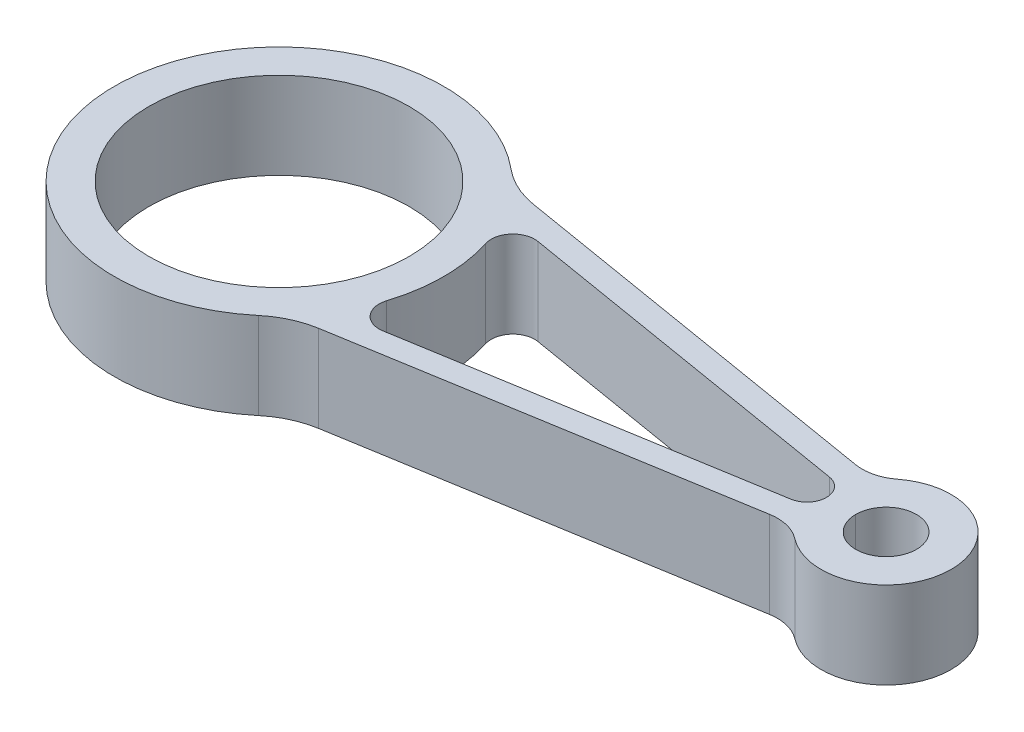
ISO-10303-21;
HEADER;
FILE_DESCRIPTION(('STEP AP214'),'2;1');
FILE_NAME('part.step','',(''),(''),'','','');
FILE_SCHEMA(('AUTOMOTIVE_DESIGN { 1 0 10303 214 1 1 1 1 }'));
ENDSEC;
DATA;
#1=APPLICATION_CONTEXT('core data for automotive mechanical design processes');
#2=APPLICATION_PROTOCOL_DEFINITION('international standard','automotive_design',2000,#1);
#3=PRODUCT_CONTEXT('',#1,'mechanical');
#4=PRODUCT('Part','Part','',(#3));
#5=PRODUCT_RELATED_PRODUCT_CATEGORY('part','',(#4));
#6=PRODUCT_DEFINITION_FORMATION('','',#4);
#7=PRODUCT_DEFINITION_CONTEXT('part definition',#1,'design');
#8=PRODUCT_DEFINITION('design','',#6,#7);
#9=PRODUCT_DEFINITION_SHAPE('','',#8);
#10=(LENGTH_UNIT() NAMED_UNIT(*) SI_UNIT(.MILLI.,.METRE.));
#11=(NAMED_UNIT(*) PLANE_ANGLE_UNIT() SI_UNIT($,.RADIAN.));
#12=(NAMED_UNIT(*) SI_UNIT($,.STERADIAN.) SOLID_ANGLE_UNIT());
#13=UNCERTAINTY_MEASURE_WITH_UNIT(LENGTH_MEASURE(1.E-05),#10,'distance_accuracy_value','');
#14=(GEOMETRIC_REPRESENTATION_CONTEXT(3) GLOBAL_UNCERTAINTY_ASSIGNED_CONTEXT((#13)) GLOBAL_UNIT_ASSIGNED_CONTEXT((#10,
#11,#12)) REPRESENTATION_CONTEXT('',''));
#15=CARTESIAN_POINT('',(0.,0.,0.));
#16=DIRECTION('',(0.,0.,1.));
#17=DIRECTION('',(1.,0.,0.));
#18=AXIS2_PLACEMENT_3D('',#15,#16,#17);
#19=CARTESIAN_POINT('',(140.,10.,0.));
#20=DIRECTION('',(0.,-1.,0.));
#21=DIRECTION('',(0.,0.,-1.));
#22=AXIS2_PLACEMENT_3D('',#19,#20,#21);
#23=CYLINDRICAL_SURFACE('',#22,7.00000000000001);
#24=CARTESIAN_POINT('',(140.,10.,0.));
#25=DIRECTION('',(0.,1.,0.));
#26=DIRECTION('',(0.,0.,1.));
#27=AXIS2_PLACEMENT_3D('',#24,#25,#26);
#28=CIRCLE('',#27,7.00000000000001);
#29=CARTESIAN_POINT('',(147.,10.,0.));
#30=VERTEX_POINT('',#29);
#31=CARTESIAN_POINT('',(133.,10.,0.));
#32=VERTEX_POINT('',#31);
#33=EDGE_CURVE('E261',#30,#32,#28,.T.);
#34=ORIENTED_EDGE('',*,*,#33,.T.);
#35=DIRECTION('',(0.,-1.,0.));
#36=VECTOR('',#35,1.);
#37=CARTESIAN_POINT('',(133.,10.,0.));
#38=LINE('',#37,#36);
#39=CARTESIAN_POINT('',(133.,-10.,0.));
#40=VERTEX_POINT('',#39);
#41=EDGE_CURVE('E12',#32,#40,#38,.T.);
#42=ORIENTED_EDGE('',*,*,#41,.T.);
#43=CARTESIAN_POINT('',(140.,-10.,0.));
#44=DIRECTION('',(0.,1.,0.));
#45=DIRECTION('',(0.,0.,1.));
#46=AXIS2_PLACEMENT_3D('',#43,#44,#45);
#47=CIRCLE('',#46,7.00000000000001);
#48=CARTESIAN_POINT('',(147.,-10.,0.));
#49=VERTEX_POINT('',#48);
#50=EDGE_CURVE('E266',#49,#40,#47,.T.);
#51=ORIENTED_EDGE('',*,*,#50,.F.);
#52=DIRECTION('',(0.,1.,0.));
#53=VECTOR('',#52,1.);
#54=CARTESIAN_POINT('',(147.,10.,0.));
#55=LINE('',#54,#53);
#56=EDGE_CURVE('E82',#49,#30,#55,.T.);
#57=ORIENTED_EDGE('',*,*,#56,.T.);
#58=EDGE_LOOP('',(#34,#42,#51,#57));
#59=FACE_BOUND('',#58,.T.);
#60=ADVANCED_FACE('F73',(#59),#23,.F.);
#61=CARTESIAN_POINT('',(140.,10.,0.));
#62=DIRECTION('',(0.,1.,0.));
#63=DIRECTION('',(0.,0.,1.));
#64=AXIS2_PLACEMENT_3D('',#61,#62,#63);
#65=PLANE('',#64);
#66=ORIENTED_EDGE('',*,*,#33,.F.);
#67=EDGE_CURVE('E265',#32,#30,#28,.T.);
#68=ORIENTED_EDGE('',*,*,#67,.F.);
#69=EDGE_LOOP('',(#66,#68));
#70=FACE_BOUND('',#69,.T.);
#71=DIRECTION('',(-0.986412795984335,0.,0.164285714285714));
#72=VECTOR('',#71,1.);
#73=CARTESIAN_POINT('',(128.063755469258,10.,9.08438586269532));
#74=LINE('',#73,#72);
#75=CARTESIAN_POINT('',(123.068754783715,10.,9.91629645714704));
#76=VERTEX_POINT('',#75);
#77=CARTESIAN_POINT('',(33.9230677395358,10.,24.7633898151861));
#78=VERTEX_POINT('',#77);
#79=EDGE_CURVE('E290',#76,#78,#74,.T.);
#80=ORIENTED_EDGE('',*,*,#79,.F.);
#81=CARTESIAN_POINT('',(124.711611926572,10.,19.7804244169904));
#82=DIRECTION('',(0.,1.,0.));
#83=DIRECTION('',(0.,0.,1.));
#84=AXIS2_PLACEMENT_3D('',#81,#82,#83);
#85=CIRCLE('',#84,10.);
#86=CARTESIAN_POINT('',(130.826967155943,10.,11.8682546501942));
#87=VERTEX_POINT('',#86);
#88=EDGE_CURVE('E324',#76,#87,#85,.F.);
#89=ORIENTED_EDGE('',*,*,#88,.T.);
#90=CARTESIAN_POINT('',(140.,10.,0.));
#91=DIRECTION('',(0.,1.,0.));
#92=DIRECTION('',(0.,0.,1.));
#93=AXIS2_PLACEMENT_3D('',#90,#91,#92);
#94=CIRCLE('',#93,15.);
#95=CARTESIAN_POINT('',(130.826967155943,10.,-11.8682546501942));
#96=VERTEX_POINT('',#95);
#97=EDGE_CURVE('E278',#87,#96,#94,.T.);
#98=ORIENTED_EDGE('',*,*,#97,.T.);
#99=CARTESIAN_POINT('',(124.711611926572,10.,-19.7804244169904));
#100=DIRECTION('',(0.,1.,0.));
#101=DIRECTION('',(0.,0.,1.));
#102=AXIS2_PLACEMENT_3D('',#99,#100,#101);
#103=CIRCLE('',#102,10.);
#104=CARTESIAN_POINT('',(123.068754783715,10.,-9.91629645714704));
#105=VERTEX_POINT('',#104);
#106=EDGE_CURVE('E330',#96,#105,#103,.F.);
#107=ORIENTED_EDGE('',*,*,#106,.T.);
#108=DIRECTION('',(0.986412795984335,0.,0.164285714285714));
#109=VECTOR('',#108,1.);
#110=CARTESIAN_POINT('',(27.9354736759495,10.,-25.7606154914888));
#111=LINE('',#110,#109);
#112=CARTESIAN_POINT('',(33.9230677395358,10.,-24.7633898151861));
#113=VERTEX_POINT('',#112);
#114=EDGE_CURVE('E282',#113,#105,#111,.T.);
#115=ORIENTED_EDGE('',*,*,#114,.F.);
#116=CARTESIAN_POINT('',(37.2087820252501,10.,-44.4916457348728));
#117=DIRECTION('',(0.,1.,0.));
#118=DIRECTION('',(0.,0.,1.));
#119=AXIS2_PLACEMENT_3D('',#116,#117,#118);
#120=CIRCLE('',#119,20.);
#121=CARTESIAN_POINT('',(24.3781675337846,10.,-29.1496989297442));
#122=VERTEX_POINT('',#121);
#123=EDGE_CURVE('E351',#113,#122,#120,.F.);
#124=ORIENTED_EDGE('',*,*,#123,.T.);
#125=CARTESIAN_POINT('',(0.,10.,0.));
#126=DIRECTION('',(0.,1.,0.));
#127=DIRECTION('',(0.,0.,1.));
#128=AXIS2_PLACEMENT_3D('',#125,#126,#127);
#129=CIRCLE('',#128,38.);
#130=CARTESIAN_POINT('',(24.3781675337846,10.,29.1496989297442));
#131=VERTEX_POINT('',#130);
#132=EDGE_CURVE('E286',#122,#131,#129,.T.);
#133=ORIENTED_EDGE('',*,*,#132,.T.);
#134=CARTESIAN_POINT('',(37.2087820252501,10.,44.4916457348728));
#135=DIRECTION('',(0.,1.,0.));
#136=DIRECTION('',(0.,0.,1.));
#137=AXIS2_PLACEMENT_3D('',#134,#135,#136);
#138=CIRCLE('',#137,20.);
#139=EDGE_CURVE('E357',#131,#78,#138,.F.);
#140=ORIENTED_EDGE('',*,*,#139,.T.);
#141=EDGE_LOOP('',(#80,#89,#98,#107,#115,#124,#133,#140));
#142=FACE_BOUND('',#141,.T.);
#143=CARTESIAN_POINT('',(0.,10.,0.));
#144=DIRECTION('',(0.,1.,0.));
#145=DIRECTION('',(0.,0.,1.));
#146=AXIS2_PLACEMENT_3D('',#143,#144,#145);
#147=CIRCLE('',#146,30.);
#148=CARTESIAN_POINT('',(0.,10.,30.));
#149=VERTEX_POINT('',#148);
#150=EDGE_CURVE('E270',#149,#149,#147,.T.);
#151=ORIENTED_EDGE('',*,*,#150,.F.);
#152=EDGE_LOOP('',(#151));
#153=FACE_BOUND('',#152,.T.);
#154=CARTESIAN_POINT('',(41.0071259869049,10.,-12.9389187451698));
#155=DIRECTION('',(0.,1.,0.));
#156=DIRECTION('',(0.,0.,1.));
#157=AXIS2_PLACEMENT_3D('',#154,#155,#156);
#158=CIRCLE('',#157,5.);
#159=CARTESIAN_POINT('',(41.8285545583335,10.,-17.8709827250914));
#160=VERTEX_POINT('',#159);
#161=CARTESIAN_POINT('',(36.2388555233113,10.,-11.4343933096849));
#162=VERTEX_POINT('',#161);
#163=EDGE_CURVE('E191',#160,#162,#158,.T.);
#164=ORIENTED_EDGE('',*,*,#163,.F.);
#165=DIRECTION('',(-0.986412795984335,0.,-0.164285714285714));
#166=VECTOR('',#165,1.);
#167=CARTESIAN_POINT('',(41.8285545583335,10.,-17.8709827250914));
#168=LINE('',#167,#166);
#169=CARTESIAN_POINT('',(122.478416149068,10.,-4.43885758192951));
#170=VERTEX_POINT('',#169);
#171=EDGE_CURVE('E212',#170,#160,#168,.T.);
#172=ORIENTED_EDGE('',*,*,#171,.F.);
#173=CARTESIAN_POINT('',(121.739130434783,10.,0.));
#174=DIRECTION('',(0.,1.,0.));
#175=DIRECTION('',(0.,0.,1.));
#176=AXIS2_PLACEMENT_3D('',#173,#174,#175);
#177=CIRCLE('',#176,4.5);
#178=CARTESIAN_POINT('',(122.478416149068,10.,4.43885758192951));
#179=VERTEX_POINT('',#178);
#180=EDGE_CURVE('E216',#179,#170,#177,.T.);
#181=ORIENTED_EDGE('',*,*,#180,.F.);
#182=DIRECTION('',(0.986412795984335,0.,-0.164285714285714));
#183=VECTOR('',#182,1.);
#184=CARTESIAN_POINT('',(122.478416149068,10.,4.43885758192951));
#185=LINE('',#184,#183);
#186=CARTESIAN_POINT('',(41.8285545583335,10.,17.8709827250914));
#187=VERTEX_POINT('',#186);
#188=EDGE_CURVE('E239',#187,#179,#185,.T.);
#189=ORIENTED_EDGE('',*,*,#188,.F.);
#190=CARTESIAN_POINT('',(41.0071259869049,10.,12.9389187451698));
#191=DIRECTION('',(0.,1.,0.));
#192=DIRECTION('',(0.,0.,-1.));
#193=AXIS2_PLACEMENT_3D('',#190,#191,#192);
#194=CIRCLE('',#193,5.);
#195=CARTESIAN_POINT('',(36.2388555233113,10.,11.4343933096849));
#196=VERTEX_POINT('',#195);
#197=EDGE_CURVE('E235',#196,#187,#194,.T.);
#198=ORIENTED_EDGE('',*,*,#197,.F.);
#199=CARTESIAN_POINT('',(0.,10.,0.));
#200=DIRECTION('',(0.,-1.,0.));
#201=DIRECTION('',(0.,0.,-1.));
#202=AXIS2_PLACEMENT_3D('',#199,#200,#201);
#203=CIRCLE('',#202,38.);
#204=EDGE_CURVE('E232',#162,#196,#203,.T.);
#205=ORIENTED_EDGE('',*,*,#204,.F.);
#206=EDGE_LOOP('',(#164,#172,#181,#189,#198,#205));
#207=FACE_BOUND('',#206,.T.);
#208=ADVANCED_FACE('F365',(#70,#142,#153,#207),#65,.T.);
#209=CARTESIAN_POINT('',(140.,-10.,0.));
#210=DIRECTION('',(0.,1.,0.));
#211=DIRECTION('',(0.,0.,1.));
#212=AXIS2_PLACEMENT_3D('',#209,#210,#211);
#213=PLANE('',#212);
#214=CARTESIAN_POINT('',(140.,-10.,0.));
#215=DIRECTION('',(0.,1.,0.));
#216=DIRECTION('',(0.,0.,1.));
#217=AXIS2_PLACEMENT_3D('',#214,#215,#216);
#218=CIRCLE('',#217,15.);
#219=CARTESIAN_POINT('',(130.826967155943,-10.,11.8682546501942));
#220=VERTEX_POINT('',#219);
#221=CARTESIAN_POINT('',(130.826967155943,-10.,-11.8682546501942));
#222=VERTEX_POINT('',#221);
#223=EDGE_CURVE('E274',#220,#222,#218,.T.);
#224=ORIENTED_EDGE('',*,*,#223,.F.);
#225=CARTESIAN_POINT('',(124.711611926572,-10.,19.7804244169904));
#226=DIRECTION('',(0.,1.,0.));
#227=DIRECTION('',(0.,0.,1.));
#228=AXIS2_PLACEMENT_3D('',#225,#226,#227);
#229=CIRCLE('',#228,10.);
#230=CARTESIAN_POINT('',(123.068754783715,-10.,9.91629645714704));
#231=VERTEX_POINT('',#230);
#232=EDGE_CURVE('E321',#220,#231,#229,.T.);
#233=ORIENTED_EDGE('',*,*,#232,.T.);
#234=DIRECTION('',(-0.986412795984335,0.,0.164285714285714));
#235=VECTOR('',#234,1.);
#236=CARTESIAN_POINT('',(128.063755469258,-10.,9.08438586269532));
#237=LINE('',#236,#235);
#238=CARTESIAN_POINT('',(33.9230677395358,-10.,24.7633898151861));
#239=VERTEX_POINT('',#238);
#240=EDGE_CURVE('E283',#231,#239,#237,.T.);
#241=ORIENTED_EDGE('',*,*,#240,.T.);
#242=CARTESIAN_POINT('',(37.2087820252501,-10.,44.4916457348728));
#243=DIRECTION('',(0.,1.,0.));
#244=DIRECTION('',(0.,0.,1.));
#245=AXIS2_PLACEMENT_3D('',#242,#243,#244);
#246=CIRCLE('',#245,20.);
#247=CARTESIAN_POINT('',(24.3781675337846,-10.,29.1496989297442));
#248=VERTEX_POINT('',#247);
#249=EDGE_CURVE('E354',#239,#248,#246,.T.);
#250=ORIENTED_EDGE('',*,*,#249,.T.);
#251=CARTESIAN_POINT('',(0.,-10.,0.));
#252=DIRECTION('',(0.,1.,0.));
#253=DIRECTION('',(0.,0.,1.));
#254=AXIS2_PLACEMENT_3D('',#251,#252,#253);
#255=CIRCLE('',#254,38.);
#256=CARTESIAN_POINT('',(24.3781675337846,-10.,-29.1496989297442));
#257=VERTEX_POINT('',#256);
#258=EDGE_CURVE('E301',#257,#248,#255,.T.);
#259=ORIENTED_EDGE('',*,*,#258,.F.);
#260=CARTESIAN_POINT('',(37.2087820252501,-10.,-44.4916457348728));
#261=DIRECTION('',(0.,1.,0.));
#262=DIRECTION('',(0.,0.,1.));
#263=AXIS2_PLACEMENT_3D('',#260,#261,#262);
#264=CIRCLE('',#263,20.);
#265=CARTESIAN_POINT('',(33.9230677395358,-10.,-24.7633898151861));
#266=VERTEX_POINT('',#265);
#267=EDGE_CURVE('E348',#257,#266,#264,.T.);
#268=ORIENTED_EDGE('',*,*,#267,.T.);
#269=DIRECTION('',(0.986412795984335,0.,0.164285714285714));
#270=VECTOR('',#269,1.);
#271=CARTESIAN_POINT('',(27.9354736759495,-10.,-25.7606154914888));
#272=LINE('',#271,#270);
#273=CARTESIAN_POINT('',(123.068754783715,-10.,-9.91629645714704));
#274=VERTEX_POINT('',#273);
#275=EDGE_CURVE('E298',#266,#274,#272,.T.);
#276=ORIENTED_EDGE('',*,*,#275,.T.);
#277=CARTESIAN_POINT('',(124.711611926572,-10.,-19.7804244169904));
#278=DIRECTION('',(0.,1.,0.));
#279=DIRECTION('',(0.,0.,1.));
#280=AXIS2_PLACEMENT_3D('',#277,#278,#279);
#281=CIRCLE('',#280,10.);
#282=EDGE_CURVE('E327',#274,#222,#281,.T.);
#283=ORIENTED_EDGE('',*,*,#282,.T.);
#284=EDGE_LOOP('',(#224,#233,#241,#250,#259,#268,#276,#283));
#285=FACE_BOUND('',#284,.T.);
#286=CARTESIAN_POINT('',(0.,-10.,0.));
#287=DIRECTION('',(0.,1.,0.));
#288=DIRECTION('',(0.,0.,1.));
#289=AXIS2_PLACEMENT_3D('',#286,#287,#288);
#290=CIRCLE('',#289,30.);
#291=CARTESIAN_POINT('',(0.,-10.,30.));
#292=VERTEX_POINT('',#291);
#293=EDGE_CURVE('E264',#292,#292,#290,.T.);
#294=ORIENTED_EDGE('',*,*,#293,.T.);
#295=EDGE_LOOP('',(#294));
#296=FACE_BOUND('',#295,.T.);
#297=ORIENTED_EDGE('',*,*,#50,.T.);
#298=EDGE_CURVE('E249',#40,#49,#47,.T.);
#299=ORIENTED_EDGE('',*,*,#298,.T.);
#300=EDGE_LOOP('',(#297,#299));
#301=FACE_BOUND('',#300,.T.);
#302=DIRECTION('',(-0.986412795984335,0.,-0.164285714285714));
#303=VECTOR('',#302,1.);
#304=CARTESIAN_POINT('',(41.8285545583335,-10.,-17.8709827250914));
#305=LINE('',#304,#303);
#306=CARTESIAN_POINT('',(122.478416149068,-10.,-4.43885758192951));
#307=VERTEX_POINT('',#306);
#308=CARTESIAN_POINT('',(41.8285545583335,-10.,-17.8709827250914));
#309=VERTEX_POINT('',#308);
#310=EDGE_CURVE('E197',#307,#309,#305,.T.);
#311=ORIENTED_EDGE('',*,*,#310,.T.);
#312=CARTESIAN_POINT('',(41.0071259869049,-10.,-12.9389187451698));
#313=DIRECTION('',(0.,1.,0.));
#314=DIRECTION('',(0.,0.,1.));
#315=AXIS2_PLACEMENT_3D('',#312,#313,#314);
#316=CIRCLE('',#315,5.);
#317=CARTESIAN_POINT('',(36.2388555233113,-10.,-11.4343933096849));
#318=VERTEX_POINT('',#317);
#319=EDGE_CURVE('E188',#309,#318,#316,.T.);
#320=ORIENTED_EDGE('',*,*,#319,.T.);
#321=CARTESIAN_POINT('',(0.,-10.,0.));
#322=DIRECTION('',(0.,-1.,0.));
#323=DIRECTION('',(0.,0.,-1.));
#324=AXIS2_PLACEMENT_3D('',#321,#322,#323);
#325=CIRCLE('',#324,38.);
#326=CARTESIAN_POINT('',(36.2388555233113,-10.,11.4343933096849));
#327=VERTEX_POINT('',#326);
#328=EDGE_CURVE('E201',#318,#327,#325,.T.);
#329=ORIENTED_EDGE('',*,*,#328,.T.);
#330=CARTESIAN_POINT('',(41.0071259869049,-10.,12.9389187451698));
#331=DIRECTION('',(0.,1.,0.));
#332=DIRECTION('',(0.,0.,-1.));
#333=AXIS2_PLACEMENT_3D('',#330,#331,#332);
#334=CIRCLE('',#333,5.);
#335=CARTESIAN_POINT('',(41.8285545583335,-10.,17.8709827250914));
#336=VERTEX_POINT('',#335);
#337=EDGE_CURVE('E206',#327,#336,#334,.T.);
#338=ORIENTED_EDGE('',*,*,#337,.T.);
#339=DIRECTION('',(0.986412795984335,0.,-0.164285714285714));
#340=VECTOR('',#339,1.);
#341=CARTESIAN_POINT('',(122.478416149068,-10.,4.43885758192951));
#342=LINE('',#341,#340);
#343=CARTESIAN_POINT('',(122.478416149068,-10.,4.43885758192951));
#344=VERTEX_POINT('',#343);
#345=EDGE_CURVE('E221',#336,#344,#342,.T.);
#346=ORIENTED_EDGE('',*,*,#345,.T.);
#347=CARTESIAN_POINT('',(121.739130434783,-10.,0.));
#348=DIRECTION('',(0.,1.,0.));
#349=DIRECTION('',(0.,0.,1.));
#350=AXIS2_PLACEMENT_3D('',#347,#348,#349);
#351=CIRCLE('',#350,4.5);
#352=EDGE_CURVE('E225',#344,#307,#351,.T.);
#353=ORIENTED_EDGE('',*,*,#352,.T.);
#354=EDGE_LOOP('',(#311,#320,#329,#338,#346,#353));
#355=FACE_BOUND('',#354,.T.);
#356=ADVANCED_FACE('F208',(#285,#296,#301,#355),#213,.F.);
#357=CARTESIAN_POINT('',(140.,10.,0.));
#358=DIRECTION('',(0.,-1.,0.));
#359=DIRECTION('',(0.,0.,-1.));
#360=AXIS2_PLACEMENT_3D('',#357,#358,#359);
#361=CYLINDRICAL_SURFACE('',#360,15.);
#362=ORIENTED_EDGE('',*,*,#97,.F.);
#363=DIRECTION('',(0.,-1.,0.));
#364=VECTOR('',#363,1.);
#365=CARTESIAN_POINT('',(130.826967155943,10.,11.8682546501942));
#366=LINE('',#365,#364);
#367=EDGE_CURVE('E310',#87,#220,#366,.T.);
#368=ORIENTED_EDGE('',*,*,#367,.T.);
#369=ORIENTED_EDGE('',*,*,#223,.T.);
#370=DIRECTION('',(0.,-1.,0.));
#371=VECTOR('',#370,1.);
#372=CARTESIAN_POINT('',(130.826967155943,10.,-11.8682546501942));
#373=LINE('',#372,#371);
#374=EDGE_CURVE('E294',#222,#96,#373,.F.);
#375=ORIENTED_EDGE('',*,*,#374,.T.);
#376=EDGE_LOOP('',(#362,#368,#369,#375));
#377=FACE_BOUND('',#376,.T.);
#378=ADVANCED_FACE('F394',(#377),#361,.T.);
#379=CARTESIAN_POINT('',(27.9354736759495,10.,-25.7606154914888));
#380=DIRECTION('',(0.164285714285714,0.,-0.986412795984335));
#381=DIRECTION('',(-0.986412795984335,0.,-0.164285714285714));
#382=AXIS2_PLACEMENT_3D('',#379,#380,#381);
#383=PLANE('',#382);
#384=ORIENTED_EDGE('',*,*,#275,.F.);
#385=DIRECTION('',(0.,-1.,0.));
#386=VECTOR('',#385,1.);
#387=CARTESIAN_POINT('',(33.9230677395358,10.,-24.7633898151861));
#388=LINE('',#387,#386);
#389=EDGE_CURVE('E341',#266,#113,#388,.F.);
#390=ORIENTED_EDGE('',*,*,#389,.T.);
#391=ORIENTED_EDGE('',*,*,#114,.T.);
#392=DIRECTION('',(0.,-1.,0.));
#393=VECTOR('',#392,1.);
#394=CARTESIAN_POINT('',(123.068754783715,10.,-9.91629645714704));
#395=LINE('',#394,#393);
#396=EDGE_CURVE('E317',#105,#274,#395,.T.);
#397=ORIENTED_EDGE('',*,*,#396,.T.);
#398=EDGE_LOOP('',(#384,#390,#391,#397));
#399=FACE_BOUND('',#398,.T.);
#400=ADVANCED_FACE('F404',(#399),#383,.T.);
#401=CARTESIAN_POINT('',(0.,10.,0.));
#402=DIRECTION('',(0.,-1.,0.));
#403=DIRECTION('',(0.,0.,-1.));
#404=AXIS2_PLACEMENT_3D('',#401,#402,#403);
#405=CYLINDRICAL_SURFACE('',#404,38.);
#406=ORIENTED_EDGE('',*,*,#132,.F.);
#407=DIRECTION('',(0.,-1.,0.));
#408=VECTOR('',#407,1.);
#409=CARTESIAN_POINT('',(24.3781675337846,10.,-29.1496989297442));
#410=LINE('',#409,#408);
#411=EDGE_CURVE('E337',#122,#257,#410,.T.);
#412=ORIENTED_EDGE('',*,*,#411,.T.);
#413=ORIENTED_EDGE('',*,*,#258,.T.);
#414=DIRECTION('',(0.,-1.,0.));
#415=VECTOR('',#414,1.);
#416=CARTESIAN_POINT('',(24.3781675337846,10.,29.1496989297442));
#417=LINE('',#416,#415);
#418=EDGE_CURVE('E334',#248,#131,#417,.F.);
#419=ORIENTED_EDGE('',*,*,#418,.T.);
#420=EDGE_LOOP('',(#406,#412,#413,#419));
#421=FACE_BOUND('',#420,.T.);
#422=ADVANCED_FACE('F400',(#421),#405,.T.);
#423=CARTESIAN_POINT('',(128.063755469258,10.,9.08438586269532));
#424=DIRECTION('',(0.164285714285714,0.,0.986412795984335));
#425=DIRECTION('',(0.986412795984335,0.,-0.164285714285714));
#426=AXIS2_PLACEMENT_3D('',#423,#424,#425);
#427=PLANE('',#426);
#428=ORIENTED_EDGE('',*,*,#79,.T.);
#429=DIRECTION('',(0.,-1.,0.));
#430=VECTOR('',#429,1.);
#431=CARTESIAN_POINT('',(33.9230677395358,10.,24.7633898151861));
#432=LINE('',#431,#430);
#433=EDGE_CURVE('E344',#78,#239,#432,.T.);
#434=ORIENTED_EDGE('',*,*,#433,.T.);
#435=ORIENTED_EDGE('',*,*,#240,.F.);
#436=DIRECTION('',(0.,-1.,0.));
#437=VECTOR('',#436,1.);
#438=CARTESIAN_POINT('',(123.068754783715,10.,9.91629645714704));
#439=LINE('',#438,#437);
#440=EDGE_CURVE('E314',#231,#76,#439,.F.);
#441=ORIENTED_EDGE('',*,*,#440,.T.);
#442=EDGE_LOOP('',(#428,#434,#435,#441));
#443=FACE_BOUND('',#442,.T.);
#444=ADVANCED_FACE('F382',(#443),#427,.T.);
#445=CARTESIAN_POINT('',(0.,10.,0.));
#446=DIRECTION('',(0.,-1.,0.));
#447=DIRECTION('',(0.,0.,-1.));
#448=AXIS2_PLACEMENT_3D('',#445,#446,#447);
#449=CYLINDRICAL_SURFACE('',#448,30.);
#450=ORIENTED_EDGE('',*,*,#150,.T.);
#451=EDGE_LOOP('',(#450));
#452=FACE_BOUND('',#451,.T.);
#453=ORIENTED_EDGE('',*,*,#293,.F.);
#454=EDGE_LOOP('',(#453));
#455=FACE_BOUND('',#454,.T.);
#456=ADVANCED_FACE('F373',(#452,#455),#449,.F.);
#457=ORIENTED_EDGE('',*,*,#41,.F.);
#458=ORIENTED_EDGE('',*,*,#67,.T.);
#459=ORIENTED_EDGE('',*,*,#56,.F.);
#460=ORIENTED_EDGE('',*,*,#298,.F.);
#461=EDGE_LOOP('',(#457,#458,#459,#460));
#462=FACE_BOUND('',#461,.T.);
#463=ADVANCED_FACE('F370',(#462),#23,.F.);
#464=CARTESIAN_POINT('',(124.711611926572,10.,19.7804244169904));
#465=DIRECTION('',(0.,-1.,0.));
#466=DIRECTION('',(0.,0.,-1.));
#467=AXIS2_PLACEMENT_3D('',#464,#465,#466);
#468=CYLINDRICAL_SURFACE('',#467,10.);
#469=ORIENTED_EDGE('',*,*,#88,.F.);
#470=ORIENTED_EDGE('',*,*,#440,.F.);
#471=ORIENTED_EDGE('',*,*,#232,.F.);
#472=ORIENTED_EDGE('',*,*,#367,.F.);
#473=EDGE_LOOP('',(#469,#470,#471,#472));
#474=FACE_BOUND('',#473,.T.);
#475=ADVANCED_FACE('F372',(#474),#468,.F.);
#476=CARTESIAN_POINT('',(124.711611926572,10.,-19.7804244169904));
#477=DIRECTION('',(0.,-1.,0.));
#478=DIRECTION('',(0.,0.,-1.));
#479=AXIS2_PLACEMENT_3D('',#476,#477,#478);
#480=CYLINDRICAL_SURFACE('',#479,10.);
#481=ORIENTED_EDGE('',*,*,#106,.F.);
#482=ORIENTED_EDGE('',*,*,#374,.F.);
#483=ORIENTED_EDGE('',*,*,#282,.F.);
#484=ORIENTED_EDGE('',*,*,#396,.F.);
#485=EDGE_LOOP('',(#481,#482,#483,#484));
#486=FACE_BOUND('',#485,.T.);
#487=ADVANCED_FACE('F379',(#486),#480,.F.);
#488=CARTESIAN_POINT('',(37.2087820252501,10.,-44.4916457348728));
#489=DIRECTION('',(0.,-1.,0.));
#490=DIRECTION('',(0.,0.,-1.));
#491=AXIS2_PLACEMENT_3D('',#488,#489,#490);
#492=CYLINDRICAL_SURFACE('',#491,20.);
#493=ORIENTED_EDGE('',*,*,#123,.F.);
#494=ORIENTED_EDGE('',*,*,#389,.F.);
#495=ORIENTED_EDGE('',*,*,#267,.F.);
#496=ORIENTED_EDGE('',*,*,#411,.F.);
#497=EDGE_LOOP('',(#493,#494,#495,#496));
#498=FACE_BOUND('',#497,.T.);
#499=ADVANCED_FACE('F413',(#498),#492,.F.);
#500=CARTESIAN_POINT('',(37.2087820252501,10.,44.4916457348728));
#501=DIRECTION('',(0.,-1.,0.));
#502=DIRECTION('',(0.,0.,-1.));
#503=AXIS2_PLACEMENT_3D('',#500,#501,#502);
#504=CYLINDRICAL_SURFACE('',#503,20.);
#505=ORIENTED_EDGE('',*,*,#139,.F.);
#506=ORIENTED_EDGE('',*,*,#418,.F.);
#507=ORIENTED_EDGE('',*,*,#249,.F.);
#508=ORIENTED_EDGE('',*,*,#433,.F.);
#509=EDGE_LOOP('',(#505,#506,#507,#508));
#510=FACE_BOUND('',#509,.T.);
#511=ADVANCED_FACE('F75',(#510),#504,.F.);
#512=CARTESIAN_POINT('',(41.0071259869049,-10.,-12.9389187451698));
#513=DIRECTION('',(0.,1.,0.));
#514=DIRECTION('',(0.,0.,1.));
#515=AXIS2_PLACEMENT_3D('',#512,#513,#514);
#516=CYLINDRICAL_SURFACE('',#515,5.);
#517=ORIENTED_EDGE('',*,*,#163,.T.);
#518=DIRECTION('',(0.,1.,0.));
#519=VECTOR('',#518,1.);
#520=CARTESIAN_POINT('',(36.2388555233113,-10.,-11.4343933096849));
#521=LINE('',#520,#519);
#522=EDGE_CURVE('E184',#318,#162,#521,.T.);
#523=ORIENTED_EDGE('',*,*,#522,.F.);
#524=ORIENTED_EDGE('',*,*,#319,.F.);
#525=DIRECTION('',(0.,1.,0.));
#526=VECTOR('',#525,1.);
#527=CARTESIAN_POINT('',(41.8285545583335,-10.,-17.8709827250914));
#528=LINE('',#527,#526);
#529=EDGE_CURVE('E246',#309,#160,#528,.T.);
#530=ORIENTED_EDGE('',*,*,#529,.T.);
#531=EDGE_LOOP('',(#517,#523,#524,#530));
#532=FACE_BOUND('',#531,.T.);
#533=ADVANCED_FACE('F186',(#532),#516,.F.);
#534=CARTESIAN_POINT('',(41.8285545583335,-10.,-17.8709827250914));
#535=DIRECTION('',(0.164285714285714,0.,-0.986412795984335));
#536=DIRECTION('',(-0.986412795984335,0.,-0.164285714285714));
#537=AXIS2_PLACEMENT_3D('',#534,#535,#536);
#538=PLANE('',#537);
#539=ORIENTED_EDGE('',*,*,#171,.T.);
#540=ORIENTED_EDGE('',*,*,#529,.F.);
#541=ORIENTED_EDGE('',*,*,#310,.F.);
#542=DIRECTION('',(0.,1.,0.));
#543=VECTOR('',#542,1.);
#544=CARTESIAN_POINT('',(122.478416149068,-10.,-4.43885758192951));
#545=LINE('',#544,#543);
#546=EDGE_CURVE('E250',#307,#170,#545,.T.);
#547=ORIENTED_EDGE('',*,*,#546,.T.);
#548=EDGE_LOOP('',(#539,#540,#541,#547));
#549=FACE_BOUND('',#548,.T.);
#550=ADVANCED_FACE('F461',(#549),#538,.F.);
#551=CARTESIAN_POINT('',(121.739130434783,-10.,0.));
#552=DIRECTION('',(0.,1.,0.));
#553=DIRECTION('',(0.,0.,1.));
#554=AXIS2_PLACEMENT_3D('',#551,#552,#553);
#555=CYLINDRICAL_SURFACE('',#554,4.5);
#556=ORIENTED_EDGE('',*,*,#180,.T.);
#557=ORIENTED_EDGE('',*,*,#546,.F.);
#558=ORIENTED_EDGE('',*,*,#352,.F.);
#559=DIRECTION('',(0.,1.,0.));
#560=VECTOR('',#559,1.);
#561=CARTESIAN_POINT('',(122.478416149068,-10.,4.43885758192951));
#562=LINE('',#561,#560);
#563=EDGE_CURVE('E253',#344,#179,#562,.T.);
#564=ORIENTED_EDGE('',*,*,#563,.T.);
#565=EDGE_LOOP('',(#556,#557,#558,#564));
#566=FACE_BOUND('',#565,.T.);
#567=ADVANCED_FACE('F459',(#566),#555,.F.);
#568=CARTESIAN_POINT('',(122.478416149068,-10.,4.43885758192951));
#569=DIRECTION('',(0.164285714285714,0.,0.986412795984335));
#570=DIRECTION('',(0.986412795984335,0.,-0.164285714285714));
#571=AXIS2_PLACEMENT_3D('',#568,#569,#570);
#572=PLANE('',#571);
#573=ORIENTED_EDGE('',*,*,#188,.T.);
#574=ORIENTED_EDGE('',*,*,#563,.F.);
#575=ORIENTED_EDGE('',*,*,#345,.F.);
#576=DIRECTION('',(0.,1.,0.));
#577=VECTOR('',#576,1.);
#578=CARTESIAN_POINT('',(41.8285545583335,-10.,17.8709827250914));
#579=LINE('',#578,#577);
#580=EDGE_CURVE('E256',#336,#187,#579,.T.);
#581=ORIENTED_EDGE('',*,*,#580,.T.);
#582=EDGE_LOOP('',(#573,#574,#575,#581));
#583=FACE_BOUND('',#582,.T.);
#584=ADVANCED_FACE('F457',(#583),#572,.F.);
#585=CARTESIAN_POINT('',(41.0071259869049,-10.,12.9389187451698));
#586=DIRECTION('',(0.,1.,0.));
#587=DIRECTION('',(0.,0.,1.));
#588=AXIS2_PLACEMENT_3D('',#585,#586,#587);
#589=CYLINDRICAL_SURFACE('',#588,5.);
#590=ORIENTED_EDGE('',*,*,#197,.T.);
#591=ORIENTED_EDGE('',*,*,#580,.F.);
#592=ORIENTED_EDGE('',*,*,#337,.F.);
#593=DIRECTION('',(0.,1.,0.));
#594=VECTOR('',#593,1.);
#595=CARTESIAN_POINT('',(36.2388555233113,-10.,11.4343933096849));
#596=LINE('',#595,#594);
#597=EDGE_CURVE('E196',#327,#196,#596,.T.);
#598=ORIENTED_EDGE('',*,*,#597,.T.);
#599=EDGE_LOOP('',(#590,#591,#592,#598));
#600=FACE_BOUND('',#599,.T.);
#601=ADVANCED_FACE('F453',(#600),#589,.F.);
#602=CARTESIAN_POINT('',(0.,-10.,0.));
#603=DIRECTION('',(0.,1.,0.));
#604=DIRECTION('',(0.,0.,1.));
#605=AXIS2_PLACEMENT_3D('',#602,#603,#604);
#606=CYLINDRICAL_SURFACE('',#605,38.);
#607=ORIENTED_EDGE('',*,*,#204,.T.);
#608=ORIENTED_EDGE('',*,*,#597,.F.);
#609=ORIENTED_EDGE('',*,*,#328,.F.);
#610=ORIENTED_EDGE('',*,*,#522,.T.);
#611=EDGE_LOOP('',(#607,#608,#609,#610));
#612=FACE_BOUND('',#611,.T.);
#613=ADVANCED_FACE('F202',(#612),#606,.T.);
#614=CLOSED_SHELL('',(#60,#208,#356,#378,#400,#422,#444,#456,#463,#475,#487,#499,#511,#533,#550,
#567,#584,#601,#613));
#615=MANIFOLD_SOLID_BREP('B2',#614);
#616=ADVANCED_BREP_SHAPE_REPRESENTATION('',(#18,#615),#14);
#617=SHAPE_DEFINITION_REPRESENTATION(#9,#616);
ENDSEC;
END-ISO-10303-21;
